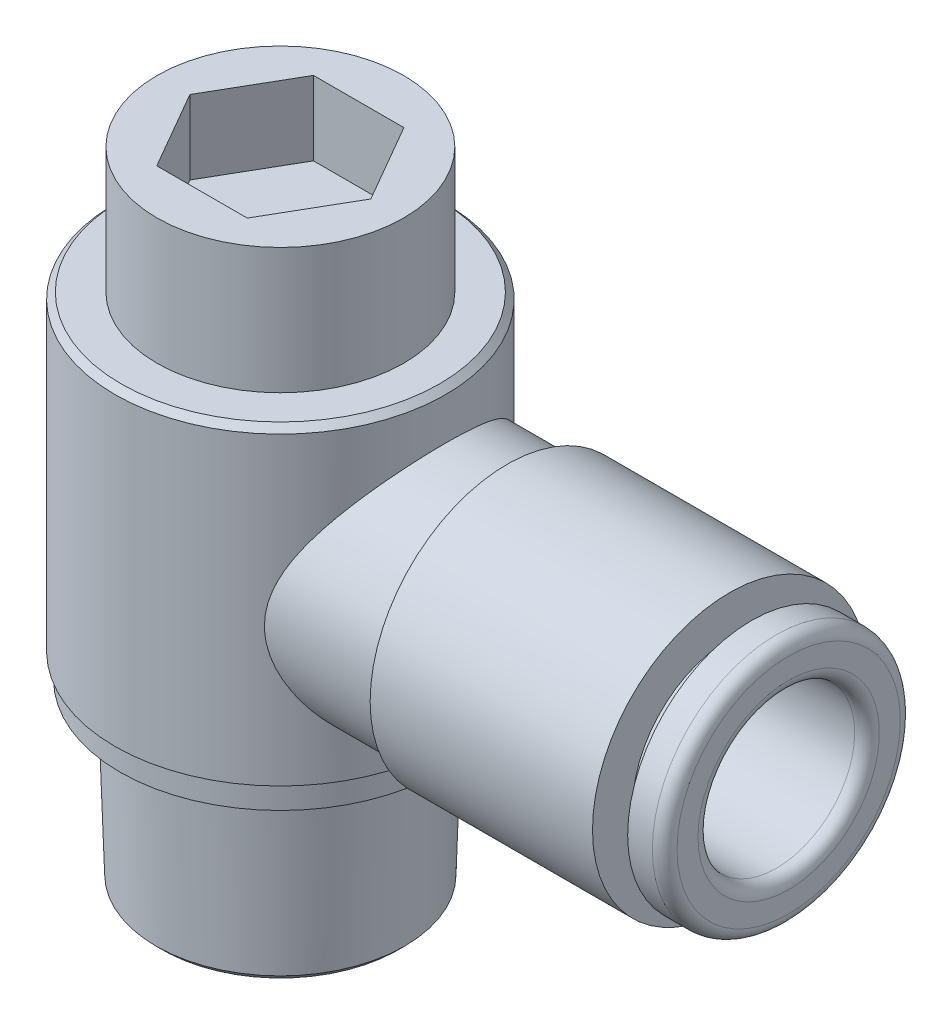
ISO-10303-21;
HEADER;
FILE_DESCRIPTION(('STEP AP214'),'2;1');
FILE_NAME('part.step','',(''),(''),'','','');
FILE_SCHEMA(('AUTOMOTIVE_DESIGN { 1 0 10303 214 1 1 1 1 }'));
ENDSEC;
DATA;
#1=APPLICATION_CONTEXT('core data for automotive mechanical design processes');
#2=APPLICATION_PROTOCOL_DEFINITION('international standard','automotive_design',2000,#1);
#3=PRODUCT_CONTEXT('',#1,'mechanical');
#4=PRODUCT('Part','Part','',(#3));
#5=PRODUCT_RELATED_PRODUCT_CATEGORY('part','',(#4));
#6=PRODUCT_DEFINITION_FORMATION('','',#4);
#7=PRODUCT_DEFINITION_CONTEXT('part definition',#1,'design');
#8=PRODUCT_DEFINITION('design','',#6,#7);
#9=PRODUCT_DEFINITION_SHAPE('','',#8);
#10=(LENGTH_UNIT() NAMED_UNIT(*) SI_UNIT(.MILLI.,.METRE.));
#11=(NAMED_UNIT(*) PLANE_ANGLE_UNIT() SI_UNIT($,.RADIAN.));
#12=(NAMED_UNIT(*) SI_UNIT($,.STERADIAN.) SOLID_ANGLE_UNIT());
#13=UNCERTAINTY_MEASURE_WITH_UNIT(LENGTH_MEASURE(1.E-05),#10,'distance_accuracy_value','');
#14=(GEOMETRIC_REPRESENTATION_CONTEXT(3) GLOBAL_UNCERTAINTY_ASSIGNED_CONTEXT((#13)) GLOBAL_UNIT_ASSIGNED_CONTEXT((#10,
#11,#12)) REPRESENTATION_CONTEXT('',''));
#15=CARTESIAN_POINT('',(0.,0.,0.));
#16=DIRECTION('',(0.,0.,1.));
#17=DIRECTION('',(1.,0.,0.));
#18=AXIS2_PLACEMENT_3D('',#15,#16,#17);
#19=CARTESIAN_POINT('',(0.,25.9504617357995,0.));
#20=DIRECTION('',(0.,-1.,0.));
#21=DIRECTION('',(0.,0.,-1.));
#22=AXIS2_PLACEMENT_3D('',#19,#20,#21);
#23=CYLINDRICAL_SURFACE('',#22,6.7);
#24=CARTESIAN_POINT('',(4.40312389105735,0.,5.05));
#25=CARTESIAN_POINT('',(4.40311942831957,0.117606987015061,5.05000228554377));
#26=CARTESIAN_POINT('',(4.40785952717692,0.235195862721557,5.04588220378257));
#27=CARTESIAN_POINT('',(4.42650886751098,0.469122908838711,5.02953019809049));
#28=CARTESIAN_POINT('',(4.44042241521763,0.585460465772232,5.01729446446795));
#29=CARTESIAN_POINT('',(4.4766420178333,0.815981020724069,4.98500336471046));
#30=CARTESIAN_POINT('',(4.49896785673152,0.930158268112624,4.96492956096863));
#31=CARTESIAN_POINT('',(4.55085121652384,1.15532135639875,4.91741706091188));
#32=CARTESIAN_POINT('',(4.58041326508135,1.26630515039091,4.88997375248413));
#33=CARTESIAN_POINT('',(4.67702968985675,1.5903466816897,4.79824643693401));
#34=CARTESIAN_POINT('',(4.75265483493136,1.79809499274183,4.72403338092795));
#35=CARTESIAN_POINT('',(4.91759208697185,2.19736186323695,4.55208242674168));
#36=CARTESIAN_POINT('',(5.00690207039019,2.38888293359687,4.45434817712701));
#37=CARTESIAN_POINT('',(5.15552000875967,2.68347379216473,4.27996829172208));
#38=CARTESIAN_POINT('',(5.21280439602058,2.79169297708923,4.21015824169164));
#39=CARTESIAN_POINT('',(5.32845753590307,3.00211433049023,4.06279751111986));
#40=CARTESIAN_POINT('',(5.38682647004383,3.10431547958257,3.98524552514834));
#41=CARTESIAN_POINT('',(5.56194115128215,3.4019951706048,3.74097194305351));
#42=CARTESIAN_POINT('',(5.67860127546039,3.58837194310533,3.56273838757504));
#43=CARTESIAN_POINT('',(5.85859222970638,3.86546317468592,3.25348145345614));
#44=CARTESIAN_POINT('',(5.92475500202049,3.96484330894451,3.13169415785285));
#45=CARTESIAN_POINT('',(6.05222642521676,4.15292018332351,2.87762492819221));
#46=CARTESIAN_POINT('',(6.11353396714763,4.24161448516083,2.74534061031245));
#47=CARTESIAN_POINT('',(6.2294332016873,4.40701769419839,2.4710912647562));
#48=CARTESIAN_POINT('',(6.28403763328949,4.48374941319908,2.32914542266936));
#49=CARTESIAN_POINT('',(6.38497994652802,4.62415959134314,2.03617170224928));
#50=CARTESIAN_POINT('',(6.43132226332632,4.68784505656131,1.88514875514576));
#51=CARTESIAN_POINT('',(6.50155338795959,4.78366032363542,1.62242761511721));
#52=CARTESIAN_POINT('',(6.52798400943325,4.81949588634769,1.51274337625082));
#53=CARTESIAN_POINT('',(6.57559930148945,4.88379714156409,1.29013093747716));
#54=CARTESIAN_POINT('',(6.5967851483937,4.91226448671066,1.17720347132818));
#55=CARTESIAN_POINT('',(6.63348053435509,4.96143441656852,0.948842147878617));
#56=CARTESIAN_POINT('',(6.64899392760065,4.98214227375635,0.833410049070694));
#57=CARTESIAN_POINT('',(6.67403953756982,5.01551848834497,0.600737532541452));
#58=CARTESIAN_POINT('',(6.68357153905973,5.02818655644308,0.483497049902969));
#59=CARTESIAN_POINT('',(6.6964594829476,5.04530490137371,0.247782604432587));
#60=CARTESIAN_POINT('',(6.69979998831927,5.04973463797499,0.129306297185757));
#61=CARTESIAN_POINT('',(6.70018262077589,5.05024228893185,-0.107717462110727));
#62=CARTESIAN_POINT('',(6.69722246292009,5.04631717339332,-0.226264924378704));
#63=CARTESIAN_POINT('',(6.68506717613505,5.03017408010857,-0.462446931584983));
#64=CARTESIAN_POINT('',(6.67587320204774,5.01795763836665,-0.580081641532821));
#65=CARTESIAN_POINT('',(6.65145081115923,4.98542005882778,-0.813630900910888));
#66=CARTESIAN_POINT('',(6.63622006947759,4.96509579852751,-0.929544769746802));
#67=CARTESIAN_POINT('',(6.6006912457209,4.91750616015619,-1.15472874531951));
#68=CARTESIAN_POINT('',(6.58059311303766,4.89051398388259,-1.26408840000097));
#69=CARTESIAN_POINT('',(6.53546087013672,4.82961318026325,-1.47983724103222));
#70=CARTESIAN_POINT('',(6.5104250650812,4.79570217791775,-1.58622539307007));
#71=CARTESIAN_POINT('',(6.42856082724111,4.68417221871273,-1.90006472729724));
#72=CARTESIAN_POINT('',(6.36494910175168,4.59672139167553,-2.10235265919328));
#73=CARTESIAN_POINT('',(6.21597295032289,4.38824710372569,-2.51077114243665));
#74=CARTESIAN_POINT('',(6.12900257895077,4.26462035108816,-2.71496405381249));
#75=CARTESIAN_POINT('',(5.94326216260933,3.99307763162445,-3.10056895172942));
#76=CARTESIAN_POINT('',(5.84448230554948,3.84514142816982,-3.28196173414762));
#77=CARTESIAN_POINT('',(5.62052879275241,3.49632469053485,-3.65453605235862));
#78=CARTESIAN_POINT('',(5.49399915283214,3.29075973179338,-3.84055702030748));
#79=CARTESIAN_POINT('',(5.30560799697905,2.96142092969155,-4.09287469077231));
#80=CARTESIAN_POINT('',(5.24300221508765,2.84805748278351,-4.17257392919332));
#81=CARTESIAN_POINT('',(5.11982966890992,2.61438562023011,-4.32281984336322));
#82=CARTESIAN_POINT('',(5.0592624646639,2.49407871851405,-4.39336850346362));
#83=CARTESIAN_POINT('',(4.90590853487717,2.17059781135979,-4.5653272392725));
#84=CARTESIAN_POINT('',(4.8161313853217,1.96183520506052,-4.6591442188435));
#85=CARTESIAN_POINT('',(4.65607358329603,1.52709991459517,-4.81911156540742));
#86=CARTESIAN_POINT('',(4.58574889362723,1.30116760400856,-4.88532459861987));
#87=CARTESIAN_POINT('',(4.48710292142865,0.882598513542438,-4.97589046834176));
#88=CARTESIAN_POINT('',(4.45313554043505,0.692589747040316,-5.00603176540037));
#89=CARTESIAN_POINT('',(4.40973941315301,0.307686663977515,-5.04431386944369));
#90=CARTESIAN_POINT('',(4.40027853767266,0.112799082781473,-5.0524834828872));
#91=CARTESIAN_POINT('',(4.40748599814587,-0.276249928635703,-5.04619384906301));
#92=CARTESIAN_POINT('',(4.42417408734577,-0.470410698729641,-5.03171749476914));
#93=CARTESIAN_POINT('',(4.48088222531931,-0.852475734849247,-4.98127266259116));
#94=CARTESIAN_POINT('',(4.52093764545475,-1.04037005847367,-4.9452716004821));
#95=CARTESIAN_POINT('',(4.63693766473754,-1.47378405618354,-4.83705194720614));
#96=CARTESIAN_POINT('',(4.7206623199853,-1.71509827908915,-4.75638479917287));
#97=CARTESIAN_POINT('',(4.86051687139915,-2.06114431278504,-4.61193306164569));
#98=CARTESIAN_POINT('',(4.90961186768131,-2.17402301509389,-4.55976156501867));
#99=CARTESIAN_POINT('',(5.01114178141282,-2.39449457422574,-4.4479377548332));
#100=CARTESIAN_POINT('',(5.06357666882089,-2.50208747857745,-4.38828550855712));
#101=CARTESIAN_POINT('',(5.18479503134191,-2.74002245800712,-4.24486965990163));
#102=CARTESIAN_POINT('',(5.25419491741833,-2.86873674507521,-4.15892795977774));
#103=CARTESIAN_POINT('',(5.39401333404201,-3.11744224957251,-3.9759144508805));
#104=CARTESIAN_POINT('',(5.46443213830392,-3.23743106886425,-3.8788396009853));
#105=CARTESIAN_POINT('',(5.60425048552661,-3.46821841837122,-3.67392578811485));
#106=CARTESIAN_POINT('',(5.67365110772471,-3.57902736097646,-3.56609933501552));
#107=CARTESIAN_POINT('',(5.80972925732526,-3.7910489346739,-3.33983835724219));
#108=CARTESIAN_POINT('',(5.87640627658064,-3.8922597796465,-3.22140186607884));
#109=CARTESIAN_POINT('',(6.04644185104085,-4.14555123839121,-2.89524977104521));
#110=CARTESIAN_POINT('',(6.14615797077405,-4.28904353226121,-2.6786614021256));
#111=CARTESIAN_POINT('',(6.28122988012699,-4.47976833369188,-2.33482303954838));
#112=CARTESIAN_POINT('',(6.32384523657227,-4.53926892443405,-2.21702059561481));
#113=CARTESIAN_POINT('',(6.40338713423154,-4.6494439239526,-1.97553903031029));
#114=CARTESIAN_POINT('',(6.44031672171642,-4.70012306092306,-1.85186310258579));
#115=CARTESIAN_POINT('',(6.50796901700113,-4.79240577096887,-1.59804967500399));
#116=CARTESIAN_POINT('',(6.53862710946569,-4.83391518588821,-1.4678605892409));
#117=CARTESIAN_POINT('',(6.59246768394957,-4.90649807394438,-1.20315972910773));
#118=CARTESIAN_POINT('',(6.6156542933186,-4.93757730925044,-1.06865038662566));
#119=CARTESIAN_POINT('',(6.65390638342854,-4.9887130629795,-0.796492893098883));
#120=CARTESIAN_POINT('',(6.66897672688346,-5.00877618165064,-0.658846673103729));
#121=CARTESIAN_POINT('',(6.69056065953498,-5.03747880110979,-0.381711265973379));
#122=CARTESIAN_POINT('',(6.697075730508,-5.0461202801318,-0.242222402213161));
#123=CARTESIAN_POINT('',(6.70103250253064,-5.05136976560866,0.0160973440531477));
#124=CARTESIAN_POINT('',(6.69969110649343,-5.04959165729946,0.134881003986158));
#125=CARTESIAN_POINT('',(6.69072502341346,-5.03768964800123,0.371829828877268));
#126=CARTESIAN_POINT('',(6.68309841933952,-5.02756320071173,0.48999479406182));
#127=CARTESIAN_POINT('',(6.66173020574357,-4.99912374116432,0.724726975251465));
#128=CARTESIAN_POINT('',(6.64799105899127,-4.98081402596662,0.841294815267146));
#129=CARTESIAN_POINT('',(6.61470045190201,-4.93629170652048,1.07208280269578));
#130=CARTESIAN_POINT('',(6.59514672618428,-4.91007602202165,1.18630201649778));
#131=CARTESIAN_POINT('',(6.5295767795013,-4.82176655362491,1.5179966363163));
#132=CARTESIAN_POINT('',(6.47599256822721,-4.74914940381472,1.73129472448205));
#133=CARTESIAN_POINT('',(6.3519958517446,-4.57862025999859,2.14203887207685));
#134=CARTESIAN_POINT('',(6.28158052148861,-4.48070401940063,2.33948226290719));
#135=CARTESIAN_POINT('',(6.11780942784385,-4.24826977444291,2.74144830666337));
#136=CARTESIAN_POINT('',(6.02264734543754,-4.11061372136848,2.94341105769372));
#137=CARTESIAN_POINT('',(5.82202528338255,-3.81064058875052,3.3226666968506));
#138=CARTESIAN_POINT('',(5.71655253684358,-3.64829279356433,3.49992832394338));
#139=CARTESIAN_POINT('',(5.5446898071038,-3.37086495944864,3.76302621803477));
#140=CARTESIAN_POINT('',(5.47948587195197,-3.26275039818293,3.85713350670425));
#141=CARTESIAN_POINT('',(5.34917724551684,-3.03883233290902,4.03590488704022));
#142=CARTESIAN_POINT('',(5.28407258335144,-2.92302690001686,4.12056659536197));
#143=CARTESIAN_POINT('',(5.15566948660801,-2.68395218731259,4.28013489403464));
#144=CARTESIAN_POINT('',(5.09237077346732,-2.5606840678572,4.35504299527468));
#145=CARTESIAN_POINT('',(4.9695558004755,-2.30679642913901,4.49468206371764));
#146=CARTESIAN_POINT('',(4.91003800848298,-2.17617992864331,4.5594171691963));
#147=CARTESIAN_POINT('',(4.77375062528088,-1.85226001146856,4.70262065306627));
#148=CARTESIAN_POINT('',(4.69995829986278,-1.65527583106051,4.77578090059542));
#149=CARTESIAN_POINT('',(4.57253393606488,-1.24801789552221,4.89794056928545));
#150=CARTESIAN_POINT('',(4.51884247921434,-1.03778548977778,4.9470113353497));
#151=CARTESIAN_POINT('',(4.45462327831473,-0.688270603940741,5.00473903293676));
#152=CARTESIAN_POINT('',(4.43546080278411,-0.551907261348752,5.02164895851214));
#153=CARTESIAN_POINT('',(4.40971424930551,-0.277020788871616,5.04427764037337));
#154=CARTESIAN_POINT('',(4.40312914652338,-0.138497835884015,5.04999730846887));
#155=CARTESIAN_POINT('',(4.40312389105735,0.,5.05));
#156=B_SPLINE_CURVE_WITH_KNOTS('',3,(#24,#25,#26,#27,#28,#29,#30,#31,#32,#33,#34,#35,#36,#37,
#38,#39,#40,#41,#42,#43,#44,#45,#46,#47,#48,#49,#50,#51,#52,#53,#54,#55,#56,#57,#58,#59,#60,#61,
#62,#63,#64,#65,#66,#67,#68,#69,#70,#71,#72,#73,#74,#75,#76,#77,#78,#79,#80,#81,#82,#83,#84,#85,
#86,#87,#88,#89,#90,#91,#92,#93,#94,#95,#96,#97,#98,#99,#100,#101,#102,#103,#104,#105,#106,#107,
#108,#109,#110,#111,#112,#113,#114,#115,#116,#117,#118,#119,#120,#121,#122,#123,#124,#125,#126,
#127,#128,#129,#130,#131,#132,#133,#134,#135,#136,#137,#138,#139,#140,#141,#142,#143,#144,#145,
#146,#147,#148,#149,#150,#151,#152,#153,#154,#155),.UNSPECIFIED.,.T.,.F.,(4,2,2,2,2,2,2,2,2,2,2,
2,2,2,2,2,2,2,2,2,2,2,2,2,2,2,2,2,2,2,2,2,2,2,2,2,2,2,2,2,2,2,2,2,2,2,2,2,2,2,2,2,2,2,2,2,2,2,2,
2,2,2,2,2,2,4),(0.,0.35262672898936,0.7054191071224,1.05904641253416,1.41289554907151,
2.10965462698784,2.80630569446371,3.22881752681724,3.65140072301648,4.49724306535975,
5.00829900067637,5.51947132827788,6.02965663816903,6.53956724689269,6.89435104631899,
7.24905520099397,7.60351789962037,7.9579933524607,8.31335142296739,8.66883838633034,
9.02425951215359,9.37981765099799,9.72270351598471,10.0657072807565,10.7512171130002,
11.5106441842287,12.2707066803842,13.1811073265463,13.6369356746476,14.0926650080944,
14.8277657979802,15.5611885598813,16.1447703572948,16.7275866631228,17.3108434477816,
17.8949854133622,18.6938464667195,19.0946880697088,19.4955260677604,20.0037520568995,
20.5121172047732,21.0198976048249,21.5277723135731,22.3586691040618,22.7743157862864,
23.1897389962126,23.6092478081498,24.0285244787944,24.4475496671537,24.8665022706156,
25.2224656020363,25.5785375448924,25.934466154572,26.2905336174037,26.9823047017763,
27.6741919792658,28.4582351701166,29.2432617827006,29.7152595838827,30.1873762132745,
30.6594196218932,31.1312705079832,31.7972597702789,32.461264515581,32.8765631301691,
33.2918279037972),.UNSPECIFIED.);
#157=CARTESIAN_POINT('',(4.40312389105735,0.,5.05));
#158=VERTEX_POINT('',#157);
#159=EDGE_CURVE('E128',#158,#158,#156,.T.);
#160=ORIENTED_EDGE('',*,*,#159,.T.);
#161=EDGE_LOOP('',(#160));
#162=FACE_BOUND('',#161,.T.);
#163=CARTESIAN_POINT('',(0.,6.75,0.));
#164=DIRECTION('',(0.,1.,0.));
#165=DIRECTION('',(0.,0.,1.));
#166=AXIS2_PLACEMENT_3D('',#163,#164,#165);
#167=CIRCLE('',#166,6.7);
#168=CARTESIAN_POINT('',(0.,6.75,6.7));
#169=VERTEX_POINT('',#168);
#170=EDGE_CURVE('E167',#169,#169,#167,.F.);
#171=ORIENTED_EDGE('',*,*,#170,.T.);
#172=EDGE_LOOP('',(#171));
#173=FACE_BOUND('',#172,.T.);
#174=CARTESIAN_POINT('',(0.,-5.6,0.));
#175=DIRECTION('',(0.,1.,0.));
#176=DIRECTION('',(0.,0.,1.));
#177=AXIS2_PLACEMENT_3D('',#174,#175,#176);
#178=CIRCLE('',#177,6.7);
#179=CARTESIAN_POINT('',(0.,-5.6,6.7));
#180=VERTEX_POINT('',#179);
#181=EDGE_CURVE('E161',#180,#180,#178,.F.);
#182=ORIENTED_EDGE('',*,*,#181,.F.);
#183=EDGE_LOOP('',(#182));
#184=FACE_BOUND('',#183,.T.);
#185=ADVANCED_FACE('F37',(#162,#173,#184),#23,.T.);
#186=CARTESIAN_POINT('',(0.,7.,0.));
#187=DIRECTION('',(0.,1.,0.));
#188=DIRECTION('',(0.,0.,1.));
#189=AXIS2_PLACEMENT_3D('',#186,#187,#188);
#190=PLANE('',#189);
#191=CARTESIAN_POINT('',(0.,7.,0.));
#192=DIRECTION('',(0.,1.,0.));
#193=DIRECTION('',(0.,0.,1.));
#194=AXIS2_PLACEMENT_3D('',#191,#192,#193);
#195=CIRCLE('',#194,5.);
#196=CARTESIAN_POINT('',(0.,7.,5.));
#197=VERTEX_POINT('',#196);
#198=EDGE_CURVE('E141',#197,#197,#195,.T.);
#199=ORIENTED_EDGE('',*,*,#198,.F.);
#200=EDGE_LOOP('',(#199));
#201=FACE_BOUND('',#200,.T.);
#202=CARTESIAN_POINT('',(0.,7.,0.));
#203=DIRECTION('',(0.,1.,0.));
#204=DIRECTION('',(0.,0.,1.));
#205=AXIS2_PLACEMENT_3D('',#202,#203,#204);
#206=CIRCLE('',#205,6.45);
#207=CARTESIAN_POINT('',(0.,7.,6.45));
#208=VERTEX_POINT('',#207);
#209=EDGE_CURVE('E164',#208,#208,#206,.T.);
#210=ORIENTED_EDGE('',*,*,#209,.T.);
#211=EDGE_LOOP('',(#210));
#212=FACE_BOUND('',#211,.T.);
#213=ADVANCED_FACE('F253',(#201,#212),#190,.T.);
#214=CARTESIAN_POINT('',(0.,-5.6,0.));
#215=DIRECTION('',(0.,1.,0.));
#216=DIRECTION('',(0.,0.,1.));
#217=AXIS2_PLACEMENT_3D('',#214,#215,#216);
#218=PLANE('',#217);
#219=CARTESIAN_POINT('',(0.,-5.6,0.));
#220=DIRECTION('',(0.,1.,0.));
#221=DIRECTION('',(0.,0.,1.));
#222=AXIS2_PLACEMENT_3D('',#219,#220,#221);
#223=CIRCLE('',#222,6.5);
#224=CARTESIAN_POINT('',(0.,-5.6,6.5));
#225=VERTEX_POINT('',#224);
#226=EDGE_CURVE('E155',#225,#225,#223,.T.);
#227=ORIENTED_EDGE('',*,*,#226,.T.);
#228=EDGE_LOOP('',(#227));
#229=FACE_BOUND('',#228,.T.);
#230=ORIENTED_EDGE('',*,*,#181,.T.);
#231=EDGE_LOOP('',(#230));
#232=FACE_BOUND('',#231,.T.);
#233=ADVANCED_FACE('F251',(#229,#232),#218,.F.);
#234=CARTESIAN_POINT('',(0.,7.,0.));
#235=DIRECTION('',(0.,-1.,0.));
#236=DIRECTION('',(0.,0.,-1.));
#237=AXIS2_PLACEMENT_3D('',#234,#235,#236);
#238=CONICAL_SURFACE('',#237,6.45,0.785398163397448);
#239=ORIENTED_EDGE('',*,*,#170,.F.);
#240=EDGE_LOOP('',(#239));
#241=FACE_BOUND('',#240,.T.);
#242=ORIENTED_EDGE('',*,*,#209,.F.);
#243=EDGE_LOOP('',(#242));
#244=FACE_BOUND('',#243,.T.);
#245=ADVANCED_FACE('F249',(#241,#244),#238,.T.);
#246=CARTESIAN_POINT('',(0.,-24.9847763108502,0.));
#247=DIRECTION('',(0.,1.,0.));
#248=DIRECTION('',(0.,0.,1.));
#249=AXIS2_PLACEMENT_3D('',#246,#247,#248);
#250=CYLINDRICAL_SURFACE('',#249,6.5);
#251=CARTESIAN_POINT('',(0.,-6.6,0.));
#252=DIRECTION('',(0.,1.,0.));
#253=DIRECTION('',(0.,0.,1.));
#254=AXIS2_PLACEMENT_3D('',#251,#252,#253);
#255=CIRCLE('',#254,6.5);
#256=CARTESIAN_POINT('',(0.,-6.6,6.5));
#257=VERTEX_POINT('',#256);
#258=EDGE_CURVE('E158',#257,#257,#255,.F.);
#259=ORIENTED_EDGE('',*,*,#258,.F.);
#260=EDGE_LOOP('',(#259));
#261=FACE_BOUND('',#260,.T.);
#262=ORIENTED_EDGE('',*,*,#226,.F.);
#263=EDGE_LOOP('',(#262));
#264=FACE_BOUND('',#263,.T.);
#265=ADVANCED_FACE('F246',(#261,#264),#250,.T.);
#266=CARTESIAN_POINT('',(0.,-6.6,0.));
#267=DIRECTION('',(0.,1.,0.));
#268=DIRECTION('',(0.,0.,1.));
#269=AXIS2_PLACEMENT_3D('',#266,#267,#268);
#270=PLANE('',#269);
#271=CARTESIAN_POINT('',(0.,-6.6,0.));
#272=DIRECTION('',(0.,1.,0.));
#273=DIRECTION('',(0.,0.,1.));
#274=AXIS2_PLACEMENT_3D('',#271,#272,#273);
#275=CIRCLE('',#274,5.24727056951731);
#276=CARTESIAN_POINT('',(0.,-6.6,5.24727056951731));
#277=VERTEX_POINT('',#276);
#278=EDGE_CURVE('E152',#277,#277,#275,.T.);
#279=ORIENTED_EDGE('',*,*,#278,.T.);
#280=EDGE_LOOP('',(#279));
#281=FACE_BOUND('',#280,.T.);
#282=ORIENTED_EDGE('',*,*,#258,.T.);
#283=EDGE_LOOP('',(#282));
#284=FACE_BOUND('',#283,.T.);
#285=ADVANCED_FACE('F242',(#281,#284),#270,.F.);
#286=CARTESIAN_POINT('',(-5.0266248686953,-13.7,0.));
#287=DIRECTION('',(0.,-1.,0.));
#288=DIRECTION('',(0.,0.,-1.));
#289=AXIS2_PLACEMENT_3D('',#286,#287,#288);
#290=PLANE('',#289);
#291=CARTESIAN_POINT('',(0.,-13.7,0.));
#292=DIRECTION('',(0.,1.,0.));
#293=DIRECTION('',(0.,0.,-1.));
#294=AXIS2_PLACEMENT_3D('',#291,#292,#293);
#295=CIRCLE('',#294,1.5875);
#296=CARTESIAN_POINT('',(0.,-13.7,-1.5875));
#297=VERTEX_POINT('',#296);
#298=EDGE_CURVE('E483',#297,#297,#295,.T.);
#299=ORIENTED_EDGE('',*,*,#298,.T.);
#300=EDGE_LOOP('',(#299));
#301=FACE_BOUND('',#300,.T.);
#302=CARTESIAN_POINT('',(0.,-13.7,0.));
#303=DIRECTION('',(0.,-1.,0.));
#304=DIRECTION('',(0.,0.,-1.));
#305=AXIS2_PLACEMENT_3D('',#302,#303,#304);
#306=CIRCLE('',#305,4.77662486869529);
#307=CARTESIAN_POINT('',(0.,-13.7,-4.77662486869529));
#308=VERTEX_POINT('',#307);
#309=EDGE_CURVE('E173',#308,#308,#306,.T.);
#310=ORIENTED_EDGE('',*,*,#309,.T.);
#311=EDGE_LOOP('',(#310));
#312=FACE_BOUND('',#311,.T.);
#313=ADVANCED_FACE('F238',(#301,#312),#290,.T.);
#314=CARTESIAN_POINT('',(0.,-6.6,0.));
#315=DIRECTION('',(0.,1.,0.));
#316=DIRECTION('',(0.,0.,1.));
#317=AXIS2_PLACEMENT_3D('',#314,#315,#316);
#318=CONICAL_SURFACE('',#317,5.24727056951731,0.0310668606855028);
#319=CARTESIAN_POINT('',(0.,-13.4419815984456,0.));
#320=DIRECTION('',(0.,-1.,0.));
#321=DIRECTION('',(0.,0.,-1.));
#322=AXIS2_PLACEMENT_3D('',#319,#320,#321);
#323=CIRCLE('',#322,5.03464327024965);
#324=CARTESIAN_POINT('',(0.,-13.4419815984456,-5.03464327024965));
#325=VERTEX_POINT('',#324);
#326=EDGE_CURVE('E170',#325,#325,#323,.F.);
#327=ORIENTED_EDGE('',*,*,#326,.T.);
#328=EDGE_LOOP('',(#327));
#329=FACE_BOUND('',#328,.T.);
#330=ORIENTED_EDGE('',*,*,#278,.F.);
#331=EDGE_LOOP('',(#330));
#332=FACE_BOUND('',#331,.T.);
#333=ADVANCED_FACE('F235',(#329,#332),#318,.T.);
#334=CARTESIAN_POINT('',(0.,-13.4419815984456,0.));
#335=DIRECTION('',(0.,1.,0.));
#336=DIRECTION('',(0.,0.,1.));
#337=AXIS2_PLACEMENT_3D('',#334,#335,#336);
#338=CONICAL_SURFACE('',#337,5.03464327024965,0.785398163397458);
#339=ORIENTED_EDGE('',*,*,#309,.F.);
#340=EDGE_LOOP('',(#339));
#341=FACE_BOUND('',#340,.T.);
#342=ORIENTED_EDGE('',*,*,#326,.F.);
#343=EDGE_LOOP('',(#342));
#344=FACE_BOUND('',#343,.T.);
#345=ADVANCED_FACE('F230',(#341,#344),#338,.T.);
#346=CARTESIAN_POINT('',(0.,26.242135623731,0.));
#347=DIRECTION('',(0.,-1.,0.));
#348=DIRECTION('',(0.,0.,-1.));
#349=AXIS2_PLACEMENT_3D('',#346,#347,#348);
#350=CYLINDRICAL_SURFACE('',#349,5.);
#351=ORIENTED_EDGE('',*,*,#198,.T.);
#352=EDGE_LOOP('',(#351));
#353=FACE_BOUND('',#352,.T.);
#354=CARTESIAN_POINT('',(0.,12.1,0.));
#355=DIRECTION('',(0.,1.,0.));
#356=DIRECTION('',(0.,0.,1.));
#357=AXIS2_PLACEMENT_3D('',#354,#355,#356);
#358=CIRCLE('',#357,5.);
#359=CARTESIAN_POINT('',(0.,12.1,5.));
#360=VERTEX_POINT('',#359);
#361=EDGE_CURVE('E149',#360,#360,#358,.T.);
#362=ORIENTED_EDGE('',*,*,#361,.F.);
#363=EDGE_LOOP('',(#362));
#364=FACE_BOUND('',#363,.T.);
#365=ADVANCED_FACE('F227',(#353,#364),#350,.T.);
#366=CARTESIAN_POINT('',(0.,12.1,0.));
#367=DIRECTION('',(0.,1.,0.));
#368=DIRECTION('',(0.,0.,1.));
#369=AXIS2_PLACEMENT_3D('',#366,#367,#368);
#370=PLANE('',#369);
#371=DIRECTION('',(1.,0.,0.));
#372=VECTOR('',#371,1.);
#373=CARTESIAN_POINT('',(-1.83308710467706,12.1,3.175));
#374=LINE('',#373,#372);
#375=CARTESIAN_POINT('',(-1.83308710467706,12.1,3.175));
#376=VERTEX_POINT('',#375);
#377=CARTESIAN_POINT('',(1.83308710467706,12.1,3.175));
#378=VERTEX_POINT('',#377);
#379=EDGE_CURVE('E53',#376,#378,#374,.T.);
#380=ORIENTED_EDGE('',*,*,#379,.F.);
#381=DIRECTION('',(0.5,0.,0.866025403784439));
#382=VECTOR('',#381,1.);
#383=CARTESIAN_POINT('',(-3.66617420935412,12.1,0.));
#384=LINE('',#383,#382);
#385=CARTESIAN_POINT('',(-3.66617420935412,12.1,0.));
#386=VERTEX_POINT('',#385);
#387=EDGE_CURVE('E137',#386,#376,#384,.T.);
#388=ORIENTED_EDGE('',*,*,#387,.F.);
#389=DIRECTION('',(-0.5,0.,0.866025403784438));
#390=VECTOR('',#389,1.);
#391=CARTESIAN_POINT('',(-1.83308710467706,12.1,-3.175));
#392=LINE('',#391,#390);
#393=CARTESIAN_POINT('',(-1.83308710467706,12.1,-3.175));
#394=VERTEX_POINT('',#393);
#395=EDGE_CURVE('E135',#394,#386,#392,.T.);
#396=ORIENTED_EDGE('',*,*,#395,.F.);
#397=DIRECTION('',(-1.,0.,0.));
#398=VECTOR('',#397,1.);
#399=CARTESIAN_POINT('',(1.83308710467706,12.1,-3.175));
#400=LINE('',#399,#398);
#401=CARTESIAN_POINT('',(1.83308710467706,12.1,-3.175));
#402=VERTEX_POINT('',#401);
#403=EDGE_CURVE('E101',#402,#394,#400,.T.);
#404=ORIENTED_EDGE('',*,*,#403,.F.);
#405=DIRECTION('',(-0.5,0.,-0.866025403784439));
#406=VECTOR('',#405,1.);
#407=CARTESIAN_POINT('',(3.66617420935412,12.1,0.));
#408=LINE('',#407,#406);
#409=CARTESIAN_POINT('',(3.66617420935412,12.1,0.));
#410=VERTEX_POINT('',#409);
#411=EDGE_CURVE('E131',#410,#402,#408,.T.);
#412=ORIENTED_EDGE('',*,*,#411,.F.);
#413=DIRECTION('',(0.5,0.,-0.866025403784439));
#414=VECTOR('',#413,1.);
#415=CARTESIAN_POINT('',(1.83308710467706,12.1,3.175));
#416=LINE('',#415,#414);
#417=EDGE_CURVE('E127',#378,#410,#416,.T.);
#418=ORIENTED_EDGE('',*,*,#417,.F.);
#419=EDGE_LOOP('',(#380,#388,#396,#404,#412,#418));
#420=FACE_BOUND('',#419,.T.);
#421=ORIENTED_EDGE('',*,*,#361,.T.);
#422=EDGE_LOOP('',(#421));
#423=FACE_BOUND('',#422,.T.);
#424=ADVANCED_FACE('F226',(#420,#423),#370,.T.);
#425=CARTESIAN_POINT('',(-1.83308710467706,9.1,3.175));
#426=DIRECTION('',(0.,0.,1.));
#427=DIRECTION('',(1.,0.,0.));
#428=AXIS2_PLACEMENT_3D('',#425,#426,#427);
#429=PLANE('',#428);
#430=ORIENTED_EDGE('',*,*,#379,.T.);
#431=DIRECTION('',(0.,1.,0.));
#432=VECTOR('',#431,1.);
#433=CARTESIAN_POINT('',(1.83308710467706,9.1,3.175));
#434=LINE('',#433,#432);
#435=CARTESIAN_POINT('',(1.83308710467706,9.1,3.175));
#436=VERTEX_POINT('',#435);
#437=EDGE_CURVE('E83',#436,#378,#434,.T.);
#438=ORIENTED_EDGE('',*,*,#437,.F.);
#439=DIRECTION('',(1.,0.,0.));
#440=VECTOR('',#439,1.);
#441=CARTESIAN_POINT('',(-1.83308710467706,9.1,3.175));
#442=LINE('',#441,#440);
#443=CARTESIAN_POINT('',(-1.83308710467706,9.1,3.175));
#444=VERTEX_POINT('',#443);
#445=EDGE_CURVE('E139',#444,#436,#442,.T.);
#446=ORIENTED_EDGE('',*,*,#445,.F.);
#447=DIRECTION('',(0.,1.,0.));
#448=VECTOR('',#447,1.);
#449=CARTESIAN_POINT('',(-1.83308710467706,9.1,3.175));
#450=LINE('',#449,#448);
#451=EDGE_CURVE('E61',#444,#376,#450,.T.);
#452=ORIENTED_EDGE('',*,*,#451,.T.);
#453=EDGE_LOOP('',(#430,#438,#446,#452));
#454=FACE_BOUND('',#453,.T.);
#455=ADVANCED_FACE('F212',(#454),#429,.F.);
#456=CARTESIAN_POINT('',(-3.66617420935412,9.1,0.));
#457=DIRECTION('',(-0.866025403784439,0.,0.5));
#458=DIRECTION('',(0.5,0.,0.866025403784439));
#459=AXIS2_PLACEMENT_3D('',#456,#457,#458);
#460=PLANE('',#459);
#461=ORIENTED_EDGE('',*,*,#387,.T.);
#462=ORIENTED_EDGE('',*,*,#451,.F.);
#463=DIRECTION('',(0.5,0.,0.866025403784439));
#464=VECTOR('',#463,1.);
#465=CARTESIAN_POINT('',(-3.66617420935412,9.1,0.));
#466=LINE('',#465,#464);
#467=CARTESIAN_POINT('',(-3.66617420935412,9.1,0.));
#468=VERTEX_POINT('',#467);
#469=EDGE_CURVE('E113',#468,#444,#466,.T.);
#470=ORIENTED_EDGE('',*,*,#469,.F.);
#471=DIRECTION('',(0.,1.,0.));
#472=VECTOR('',#471,1.);
#473=CARTESIAN_POINT('',(-3.66617420935412,9.1,0.));
#474=LINE('',#473,#472);
#475=EDGE_CURVE('E105',#468,#386,#474,.T.);
#476=ORIENTED_EDGE('',*,*,#475,.T.);
#477=EDGE_LOOP('',(#461,#462,#470,#476));
#478=FACE_BOUND('',#477,.T.);
#479=ADVANCED_FACE('F209',(#478),#460,.F.);
#480=CARTESIAN_POINT('',(-1.83308710467706,9.1,-3.175));
#481=DIRECTION('',(-0.866025403784439,0.,-0.5));
#482=DIRECTION('',(-0.5,0.,0.866025403784439));
#483=AXIS2_PLACEMENT_3D('',#480,#481,#482);
#484=PLANE('',#483);
#485=ORIENTED_EDGE('',*,*,#395,.T.);
#486=ORIENTED_EDGE('',*,*,#475,.F.);
#487=DIRECTION('',(-0.5,0.,0.866025403784438));
#488=VECTOR('',#487,1.);
#489=CARTESIAN_POINT('',(-1.83308710467706,9.1,-3.175));
#490=LINE('',#489,#488);
#491=CARTESIAN_POINT('',(-1.83308710467706,9.1,-3.175));
#492=VERTEX_POINT('',#491);
#493=EDGE_CURVE('E109',#492,#468,#490,.T.);
#494=ORIENTED_EDGE('',*,*,#493,.F.);
#495=DIRECTION('',(0.,1.,0.));
#496=VECTOR('',#495,1.);
#497=CARTESIAN_POINT('',(-1.83308710467706,9.1,-3.175));
#498=LINE('',#497,#496);
#499=EDGE_CURVE('E94',#492,#394,#498,.T.);
#500=ORIENTED_EDGE('',*,*,#499,.T.);
#501=EDGE_LOOP('',(#485,#486,#494,#500));
#502=FACE_BOUND('',#501,.T.);
#503=ADVANCED_FACE('F110',(#502),#484,.F.);
#504=CARTESIAN_POINT('',(1.83308710467706,9.1,-3.175));
#505=DIRECTION('',(0.,0.,-1.));
#506=DIRECTION('',(-1.,0.,0.));
#507=AXIS2_PLACEMENT_3D('',#504,#505,#506);
#508=PLANE('',#507);
#509=ORIENTED_EDGE('',*,*,#403,.T.);
#510=ORIENTED_EDGE('',*,*,#499,.F.);
#511=DIRECTION('',(-1.,0.,0.));
#512=VECTOR('',#511,1.);
#513=CARTESIAN_POINT('',(1.83308710467706,9.1,-3.175));
#514=LINE('',#513,#512);
#515=CARTESIAN_POINT('',(1.83308710467706,9.1,-3.175));
#516=VERTEX_POINT('',#515);
#517=EDGE_CURVE('E98',#516,#492,#514,.T.);
#518=ORIENTED_EDGE('',*,*,#517,.F.);
#519=DIRECTION('',(0.,1.,0.));
#520=VECTOR('',#519,1.);
#521=CARTESIAN_POINT('',(1.83308710467706,9.1,-3.175));
#522=LINE('',#521,#520);
#523=EDGE_CURVE('E106',#516,#402,#522,.T.);
#524=ORIENTED_EDGE('',*,*,#523,.T.);
#525=EDGE_LOOP('',(#509,#510,#518,#524));
#526=FACE_BOUND('',#525,.T.);
#527=ADVANCED_FACE('F96',(#526),#508,.F.);
#528=CARTESIAN_POINT('',(3.66617420935412,9.1,0.));
#529=DIRECTION('',(0.866025403784439,0.,-0.5));
#530=DIRECTION('',(-0.5,0.,-0.866025403784439));
#531=AXIS2_PLACEMENT_3D('',#528,#529,#530);
#532=PLANE('',#531);
#533=ORIENTED_EDGE('',*,*,#411,.T.);
#534=ORIENTED_EDGE('',*,*,#523,.F.);
#535=DIRECTION('',(-0.5,0.,-0.866025403784439));
#536=VECTOR('',#535,1.);
#537=CARTESIAN_POINT('',(3.66617420935412,9.1,0.));
#538=LINE('',#537,#536);
#539=CARTESIAN_POINT('',(3.66617420935412,9.1,0.));
#540=VERTEX_POINT('',#539);
#541=EDGE_CURVE('E119',#540,#516,#538,.T.);
#542=ORIENTED_EDGE('',*,*,#541,.F.);
#543=DIRECTION('',(0.,1.,0.));
#544=VECTOR('',#543,1.);
#545=CARTESIAN_POINT('',(3.66617420935412,9.1,0.));
#546=LINE('',#545,#544);
#547=EDGE_CURVE('E144',#540,#410,#546,.T.);
#548=ORIENTED_EDGE('',*,*,#547,.T.);
#549=EDGE_LOOP('',(#533,#534,#542,#548));
#550=FACE_BOUND('',#549,.T.);
#551=ADVANCED_FACE('F217',(#550),#532,.F.);
#552=CARTESIAN_POINT('',(1.83308710467706,9.1,3.175));
#553=DIRECTION('',(0.866025403784439,0.,0.5));
#554=DIRECTION('',(0.5,0.,-0.866025403784439));
#555=AXIS2_PLACEMENT_3D('',#552,#553,#554);
#556=PLANE('',#555);
#557=ORIENTED_EDGE('',*,*,#417,.T.);
#558=ORIENTED_EDGE('',*,*,#547,.F.);
#559=DIRECTION('',(0.5,0.,-0.866025403784439));
#560=VECTOR('',#559,1.);
#561=CARTESIAN_POINT('',(1.83308710467706,9.1,3.175));
#562=LINE('',#561,#560);
#563=EDGE_CURVE('E121',#436,#540,#562,.T.);
#564=ORIENTED_EDGE('',*,*,#563,.F.);
#565=ORIENTED_EDGE('',*,*,#437,.T.);
#566=EDGE_LOOP('',(#557,#558,#564,#565));
#567=FACE_BOUND('',#566,.T.);
#568=ADVANCED_FACE('F208',(#567),#556,.F.);
#569=CARTESIAN_POINT('',(5.49926131403118,9.1,3.175));
#570=DIRECTION('',(0.,1.,0.));
#571=DIRECTION('',(0.,0.,1.));
#572=AXIS2_PLACEMENT_3D('',#569,#570,#571);
#573=PLANE('',#572);
#574=ORIENTED_EDGE('',*,*,#445,.T.);
#575=ORIENTED_EDGE('',*,*,#563,.T.);
#576=ORIENTED_EDGE('',*,*,#541,.T.);
#577=ORIENTED_EDGE('',*,*,#517,.T.);
#578=ORIENTED_EDGE('',*,*,#493,.T.);
#579=ORIENTED_EDGE('',*,*,#469,.T.);
#580=EDGE_LOOP('',(#574,#575,#576,#577,#578,#579));
#581=FACE_BOUND('',#580,.T.);
#582=ADVANCED_FACE('F116',(#581),#573,.T.);
#583=CARTESIAN_POINT('',(-16.3355334196476,0.,0.));
#584=DIRECTION('',(-1.,0.,0.));
#585=DIRECTION('',(0.,0.,1.));
#586=AXIS2_PLACEMENT_3D('',#583,#584,#585);
#587=CYLINDRICAL_SURFACE('',#586,5.05);
#588=CARTESIAN_POINT('',(8.9,0.,0.));
#589=DIRECTION('',(-1.,0.,0.));
#590=DIRECTION('',(0.,0.,1.));
#591=AXIS2_PLACEMENT_3D('',#588,#589,#590);
#592=CIRCLE('',#591,5.05);
#593=CARTESIAN_POINT('',(8.9,0.,5.05));
#594=VERTEX_POINT('',#593);
#595=EDGE_CURVE('E506',#594,#594,#592,.T.);
#596=ORIENTED_EDGE('',*,*,#595,.T.);
#597=EDGE_LOOP('',(#596));
#598=FACE_BOUND('',#597,.T.);
#599=ORIENTED_EDGE('',*,*,#159,.F.);
#600=EDGE_LOOP('',(#599));
#601=FACE_BOUND('',#600,.T.);
#602=ADVANCED_FACE('F186',(#598,#601),#587,.T.);
#603=CARTESIAN_POINT('',(18.2,0.,5.55));
#604=DIRECTION('',(1.,0.,0.));
#605=DIRECTION('',(0.,0.,-1.));
#606=AXIS2_PLACEMENT_3D('',#603,#604,#605);
#607=PLANE('',#606);
#608=CARTESIAN_POINT('',(18.2,0.,0.));
#609=DIRECTION('',(-1.,0.,0.));
#610=DIRECTION('',(0.,0.,1.));
#611=AXIS2_PLACEMENT_3D('',#608,#609,#610);
#612=CIRCLE('',#611,3.925);
#613=CARTESIAN_POINT('',(18.2,0.,3.925));
#614=VERTEX_POINT('',#613);
#615=EDGE_CURVE('E491',#614,#614,#612,.T.);
#616=ORIENTED_EDGE('',*,*,#615,.T.);
#617=EDGE_LOOP('',(#616));
#618=FACE_BOUND('',#617,.T.);
#619=CARTESIAN_POINT('',(18.2,0.,0.));
#620=DIRECTION('',(-1.,0.,0.));
#621=DIRECTION('',(0.,0.,1.));
#622=AXIS2_PLACEMENT_3D('',#619,#620,#621);
#623=CIRCLE('',#622,5.55);
#624=CARTESIAN_POINT('',(18.2,0.,5.55));
#625=VERTEX_POINT('',#624);
#626=EDGE_CURVE('E182',#625,#625,#623,.T.);
#627=ORIENTED_EDGE('',*,*,#626,.F.);
#628=EDGE_LOOP('',(#627));
#629=FACE_BOUND('',#628,.T.);
#630=ADVANCED_FACE('F191',(#618,#629),#607,.T.);
#631=CARTESIAN_POINT('',(-16.3355334196476,0.,0.));
#632=DIRECTION('',(-1.,0.,0.));
#633=DIRECTION('',(0.,0.,1.));
#634=AXIS2_PLACEMENT_3D('',#631,#632,#633);
#635=CYLINDRICAL_SURFACE('',#634,5.55);
#636=ORIENTED_EDGE('',*,*,#626,.T.);
#637=EDGE_LOOP('',(#636));
#638=FACE_BOUND('',#637,.T.);
#639=CARTESIAN_POINT('',(9.18867513459482,0.,0.));
#640=DIRECTION('',(-1.,0.,0.));
#641=DIRECTION('',(0.,0.,1.));
#642=AXIS2_PLACEMENT_3D('',#639,#640,#641);
#643=CIRCLE('',#642,5.55);
#644=CARTESIAN_POINT('',(9.18867513459482,0.,5.55));
#645=VERTEX_POINT('',#644);
#646=EDGE_CURVE('E509',#645,#645,#643,.T.);
#647=ORIENTED_EDGE('',*,*,#646,.F.);
#648=EDGE_LOOP('',(#647));
#649=FACE_BOUND('',#648,.T.);
#650=ADVANCED_FACE('F198',(#638,#649),#635,.T.);
#651=CARTESIAN_POINT('',(8.9,0.,0.));
#652=DIRECTION('',(1.,0.,0.));
#653=DIRECTION('',(0.,0.,-1.));
#654=AXIS2_PLACEMENT_3D('',#651,#652,#653);
#655=CONICAL_SURFACE('',#654,5.05,1.0471975511966);
#656=ORIENTED_EDGE('',*,*,#646,.T.);
#657=EDGE_LOOP('',(#656));
#658=FACE_BOUND('',#657,.T.);
#659=ORIENTED_EDGE('',*,*,#595,.F.);
#660=EDGE_LOOP('',(#659));
#661=FACE_BOUND('',#660,.T.);
#662=ADVANCED_FACE('F195',(#658,#661),#655,.T.);
#663=CARTESIAN_POINT('',(20.6,0.,-4.525));
#664=DIRECTION('',(-1.,0.,0.));
#665=DIRECTION('',(0.,0.,1.));
#666=AXIS2_PLACEMENT_3D('',#663,#664,#665);
#667=PLANE('',#666);
#668=CARTESIAN_POINT('',(20.6,0.,0.));
#669=DIRECTION('',(-1.,0.,0.));
#670=DIRECTION('',(0.,0.,1.));
#671=AXIS2_PLACEMENT_3D('',#668,#669,#670);
#672=CIRCLE('',#671,3.675);
#673=CARTESIAN_POINT('',(20.6,0.,3.675));
#674=VERTEX_POINT('',#673);
#675=EDGE_CURVE('E11',#674,#674,#672,.T.);
#676=ORIENTED_EDGE('',*,*,#675,.T.);
#677=EDGE_LOOP('',(#676));
#678=FACE_BOUND('',#677,.T.);
#679=CARTESIAN_POINT('',(20.6,0.,0.));
#680=DIRECTION('',(-1.,0.,0.));
#681=DIRECTION('',(0.,0.,1.));
#682=AXIS2_PLACEMENT_3D('',#679,#680,#681);
#683=CIRCLE('',#682,4.525);
#684=CARTESIAN_POINT('',(20.6,0.,4.525));
#685=VERTEX_POINT('',#684);
#686=EDGE_CURVE('E503',#685,#685,#683,.T.);
#687=ORIENTED_EDGE('',*,*,#686,.F.);
#688=EDGE_LOOP('',(#687));
#689=FACE_BOUND('',#688,.T.);
#690=ADVANCED_FACE('F193',(#678,#689),#667,.F.);
#691=CARTESIAN_POINT('',(20.1,0.,0.));
#692=DIRECTION('',(-1.,0.,0.));
#693=DIRECTION('',(0.,0.,1.));
#694=AXIS2_PLACEMENT_3D('',#691,#692,#693);
#695=TOROIDAL_SURFACE('',#694,4.525,0.499999999999999);
#696=CARTESIAN_POINT('',(20.1,0.,0.));
#697=DIRECTION('',(-1.,0.,0.));
#698=DIRECTION('',(0.,0.,1.));
#699=AXIS2_PLACEMENT_3D('',#696,#697,#698);
#700=CIRCLE('',#699,5.025);
#701=CARTESIAN_POINT('',(20.1,0.,5.025));
#702=VERTEX_POINT('',#701);
#703=EDGE_CURVE('E500',#702,#702,#700,.T.);
#704=ORIENTED_EDGE('',*,*,#703,.F.);
#705=EDGE_LOOP('',(#704));
#706=FACE_BOUND('',#705,.T.);
#707=ORIENTED_EDGE('',*,*,#686,.T.);
#708=EDGE_LOOP('',(#707));
#709=FACE_BOUND('',#708,.T.);
#710=ADVANCED_FACE('F365',(#706,#709),#695,.T.);
#711=CARTESIAN_POINT('',(0.,0.,0.));
#712=DIRECTION('',(-1.,0.,0.));
#713=DIRECTION('',(0.,0.,1.));
#714=AXIS2_PLACEMENT_3D('',#711,#712,#713);
#715=CYLINDRICAL_SURFACE('',#714,5.025);
#716=CARTESIAN_POINT('',(19.1,0.,0.));
#717=DIRECTION('',(-1.,0.,0.));
#718=DIRECTION('',(0.,0.,1.));
#719=AXIS2_PLACEMENT_3D('',#716,#717,#718);
#720=CIRCLE('',#719,5.025);
#721=CARTESIAN_POINT('',(19.1,0.,5.025));
#722=VERTEX_POINT('',#721);
#723=EDGE_CURVE('E497',#722,#722,#720,.T.);
#724=ORIENTED_EDGE('',*,*,#723,.F.);
#725=EDGE_LOOP('',(#724));
#726=FACE_BOUND('',#725,.T.);
#727=ORIENTED_EDGE('',*,*,#703,.T.);
#728=EDGE_LOOP('',(#727));
#729=FACE_BOUND('',#728,.T.);
#730=ADVANCED_FACE('F373',(#726,#729),#715,.T.);
#731=CARTESIAN_POINT('',(19.1,0.,-3.925));
#732=DIRECTION('',(1.,0.,0.));
#733=DIRECTION('',(0.,0.,-1.));
#734=AXIS2_PLACEMENT_3D('',#731,#732,#733);
#735=PLANE('',#734);
#736=CARTESIAN_POINT('',(19.1,0.,0.));
#737=DIRECTION('',(-1.,0.,0.));
#738=DIRECTION('',(0.,0.,1.));
#739=AXIS2_PLACEMENT_3D('',#736,#737,#738);
#740=CIRCLE('',#739,3.925);
#741=CARTESIAN_POINT('',(19.1,0.,3.925));
#742=VERTEX_POINT('',#741);
#743=EDGE_CURVE('E494',#742,#742,#740,.T.);
#744=ORIENTED_EDGE('',*,*,#743,.F.);
#745=EDGE_LOOP('',(#744));
#746=FACE_BOUND('',#745,.T.);
#747=ORIENTED_EDGE('',*,*,#723,.T.);
#748=EDGE_LOOP('',(#747));
#749=FACE_BOUND('',#748,.T.);
#750=ADVANCED_FACE('F380',(#746,#749),#735,.F.);
#751=CARTESIAN_POINT('',(0.,0.,0.));
#752=DIRECTION('',(-1.,0.,0.));
#753=DIRECTION('',(0.,0.,1.));
#754=AXIS2_PLACEMENT_3D('',#751,#752,#753);
#755=CYLINDRICAL_SURFACE('',#754,3.925);
#756=ORIENTED_EDGE('',*,*,#615,.F.);
#757=EDGE_LOOP('',(#756));
#758=FACE_BOUND('',#757,.T.);
#759=ORIENTED_EDGE('',*,*,#743,.T.);
#760=EDGE_LOOP('',(#759));
#761=FACE_BOUND('',#760,.T.);
#762=ADVANCED_FACE('F388',(#758,#761),#755,.T.);
#763=CARTESIAN_POINT('',(-1.68025612106916,0.,0.));
#764=DIRECTION('',(1.,0.,0.));
#765=DIRECTION('',(0.,0.,-1.));
#766=AXIS2_PLACEMENT_3D('',#763,#764,#765);
#767=CYLINDRICAL_SURFACE('',#766,3.175);
#768=CARTESIAN_POINT('',(20.1,0.,0.));
#769=DIRECTION('',(-1.,0.,0.));
#770=DIRECTION('',(0.,0.,1.));
#771=AXIS2_PLACEMENT_3D('',#768,#769,#770);
#772=CIRCLE('',#771,3.175);
#773=CARTESIAN_POINT('',(20.1,0.,-3.175));
#774=VERTEX_POINT('',#773);
#775=EDGE_CURVE('E46',#774,#774,#772,.F.);
#776=CARTESIAN_POINT('',(7.3,0.,0.));
#777=DIRECTION('',(1.,0.,0.));
#778=DIRECTION('',(0.,0.,-1.));
#779=AXIS2_PLACEMENT_3D('',#776,#777,#778);
#780=CIRCLE('',#779,3.175);
#781=CARTESIAN_POINT('',(7.3,0.,-3.175));
#782=VERTEX_POINT('',#781);
#783=EDGE_CURVE('E488',#782,#782,#780,.F.);
#784=CARTESIAN_POINT('',(20.1,0.,-3.175));
#785=CARTESIAN_POINT('',(19.9666666666667,0.,-3.175));
#786=CARTESIAN_POINT('',(19.8333333333333,0.,-3.175));
#787=CARTESIAN_POINT('',(19.5666666666667,0.,-3.175));
#788=CARTESIAN_POINT('',(19.4333333333333,0.,-3.175));
#789=CARTESIAN_POINT('',(19.1666666666667,0.,-3.175));
#790=CARTESIAN_POINT('',(19.0333333333333,0.,-3.175));
#791=CARTESIAN_POINT('',(18.7666666666667,0.,-3.175));
#792=CARTESIAN_POINT('',(18.6333333333333,0.,-3.175));
#793=CARTESIAN_POINT('',(18.3666666666667,0.,-3.175));
#794=CARTESIAN_POINT('',(18.2333333333333,0.,-3.175));
#795=CARTESIAN_POINT('',(17.9666666666667,0.,-3.175));
#796=CARTESIAN_POINT('',(17.8333333333333,0.,-3.175));
#797=CARTESIAN_POINT('',(17.5666666666667,0.,-3.175));
#798=CARTESIAN_POINT('',(17.4333333333333,0.,-3.175));
#799=CARTESIAN_POINT('',(17.1666666666667,0.,-3.175));
#800=CARTESIAN_POINT('',(17.0333333333333,0.,-3.175));
#801=CARTESIAN_POINT('',(16.7666666666667,0.,-3.175));
#802=CARTESIAN_POINT('',(16.6333333333333,0.,-3.175));
#803=CARTESIAN_POINT('',(16.3666666666667,0.,-3.175));
#804=CARTESIAN_POINT('',(16.2333333333333,0.,-3.175));
#805=CARTESIAN_POINT('',(15.9666666666667,0.,-3.175));
#806=CARTESIAN_POINT('',(15.8333333333333,0.,-3.175));
#807=CARTESIAN_POINT('',(15.5666666666667,0.,-3.175));
#808=CARTESIAN_POINT('',(15.4333333333333,0.,-3.175));
#809=CARTESIAN_POINT('',(15.1666666666667,0.,-3.175));
#810=CARTESIAN_POINT('',(15.0333333333333,0.,-3.175));
#811=CARTESIAN_POINT('',(14.7666666666667,0.,-3.175));
#812=CARTESIAN_POINT('',(14.6333333333333,0.,-3.175));
#813=CARTESIAN_POINT('',(14.3666666666667,0.,-3.175));
#814=CARTESIAN_POINT('',(14.2333333333333,0.,-3.175));
#815=CARTESIAN_POINT('',(13.9666666666667,0.,-3.175));
#816=CARTESIAN_POINT('',(13.8333333333333,0.,-3.175));
#817=CARTESIAN_POINT('',(13.5666666666667,0.,-3.175));
#818=CARTESIAN_POINT('',(13.4333333333333,0.,-3.175));
#819=CARTESIAN_POINT('',(13.1666666666667,0.,-3.175));
#820=CARTESIAN_POINT('',(13.0333333333333,0.,-3.175));
#821=CARTESIAN_POINT('',(12.7666666666667,0.,-3.175));
#822=CARTESIAN_POINT('',(12.6333333333333,0.,-3.175));
#823=CARTESIAN_POINT('',(12.3666666666667,0.,-3.175));
#824=CARTESIAN_POINT('',(12.2333333333333,0.,-3.175));
#825=CARTESIAN_POINT('',(11.9666666666667,0.,-3.175));
#826=CARTESIAN_POINT('',(11.8333333333333,0.,-3.175));
#827=CARTESIAN_POINT('',(11.5666666666667,0.,-3.175));
#828=CARTESIAN_POINT('',(11.4333333333333,0.,-3.175));
#829=CARTESIAN_POINT('',(11.1666666666667,0.,-3.175));
#830=CARTESIAN_POINT('',(11.0333333333333,0.,-3.175));
#831=CARTESIAN_POINT('',(10.7666666666667,0.,-3.175));
#832=CARTESIAN_POINT('',(10.6333333333333,0.,-3.175));
#833=CARTESIAN_POINT('',(10.3666666666667,0.,-3.175));
#834=CARTESIAN_POINT('',(10.2333333333333,0.,-3.175));
#835=CARTESIAN_POINT('',(9.96666666666667,0.,-3.175));
#836=CARTESIAN_POINT('',(9.83333333333333,0.,-3.175));
#837=CARTESIAN_POINT('',(9.56666666666667,0.,-3.175));
#838=CARTESIAN_POINT('',(9.43333333333333,0.,-3.175));
#839=CARTESIAN_POINT('',(9.16666666666667,0.,-3.175));
#840=CARTESIAN_POINT('',(9.03333333333333,0.,-3.175));
#841=CARTESIAN_POINT('',(8.76666666666667,0.,-3.175));
#842=CARTESIAN_POINT('',(8.63333333333333,0.,-3.175));
#843=CARTESIAN_POINT('',(8.36666666666667,0.,-3.175));
#844=CARTESIAN_POINT('',(8.23333333333333,0.,-3.175));
#845=CARTESIAN_POINT('',(7.96666666666667,0.,-3.175));
#846=CARTESIAN_POINT('',(7.83333333333333,0.,-3.175));
#847=CARTESIAN_POINT('',(7.56666666666667,0.,-3.175));
#848=CARTESIAN_POINT('',(7.43333333333333,0.,-3.175));
#849=CARTESIAN_POINT('',(7.3,0.,-3.175));
#850=B_SPLINE_CURVE_WITH_KNOTS('',3,(#784,#785,#786,#787,#788,#789,#790,#791,#792,#793,#794,
#795,#796,#797,#798,#799,#800,#801,#802,#803,#804,#805,#806,#807,#808,#809,#810,#811,#812,#813,
#814,#815,#816,#817,#818,#819,#820,#821,#822,#823,#824,#825,#826,#827,#828,#829,#830,#831,#832,
#833,#834,#835,#836,#837,#838,#839,#840,#841,#842,#843,#844,#845,#846,#847,#848,#849),
.UNSPECIFIED.,.F.,.F.,(4,2,2,2,2,2,2,2,2,2,2,2,2,2,2,2,2,2,2,2,2,2,2,2,2,2,2,2,2,2,2,2,4),(0.,
0.400000000000001,0.799999999999999,1.2,1.6,2.,2.4,2.8,3.2,3.6,4.,4.4,4.8,5.2,5.6,6.,6.4,6.8,
7.2,7.6,8.,8.4,8.8,9.2,9.6,10.,10.4,10.8,11.2,11.6,12.,12.4,12.8),.UNSPECIFIED.);
#851=EDGE_CURVE('BSEAM395',#774,#782,#850,.T.);
#852=ORIENTED_EDGE('',*,*,#775,.T.);
#853=ORIENTED_EDGE('',*,*,#783,.T.);
#854=ORIENTED_EDGE('',*,*,#851,.T.);
#855=ORIENTED_EDGE('',*,*,#851,.F.);
#856=EDGE_LOOP('',(#852,#854,#853,#855));
#857=FACE_BOUND('',#856,.T.);
#858=ADVANCED_FACE('F395',(#857),#767,.F.);
#859=CARTESIAN_POINT('',(7.3,0.,0.));
#860=DIRECTION('',(1.,0.,0.));
#861=DIRECTION('',(0.,0.,-1.));
#862=AXIS2_PLACEMENT_3D('',#859,#860,#861);
#863=PLANE('',#862);
#864=CARTESIAN_POINT('',(7.3,0.,0.));
#865=DIRECTION('',(1.,0.,0.));
#866=DIRECTION('',(0.,0.,-1.));
#867=AXIS2_PLACEMENT_3D('',#864,#865,#866);
#868=CIRCLE('',#867,1.5875);
#869=CARTESIAN_POINT('',(7.3,0.,-1.5875));
#870=VERTEX_POINT('',#869);
#871=EDGE_CURVE('E41',#870,#870,#868,.T.);
#872=ORIENTED_EDGE('',*,*,#871,.F.);
#873=EDGE_LOOP('',(#872));
#874=FACE_BOUND('',#873,.T.);
#875=ORIENTED_EDGE('',*,*,#783,.F.);
#876=EDGE_LOOP('',(#875));
#877=FACE_BOUND('',#876,.T.);
#878=ADVANCED_FACE('F402',(#874,#877),#863,.T.);
#879=CARTESIAN_POINT('',(20.1,0.,0.));
#880=DIRECTION('',(-1.,0.,0.));
#881=DIRECTION('',(0.,0.,1.));
#882=AXIS2_PLACEMENT_3D('',#879,#880,#881);
#883=TOROIDAL_SURFACE('',#882,3.675,0.5);
#884=ORIENTED_EDGE('',*,*,#675,.F.);
#885=EDGE_LOOP('',(#884));
#886=FACE_BOUND('',#885,.T.);
#887=ORIENTED_EDGE('',*,*,#775,.F.);
#888=EDGE_LOOP('',(#887));
#889=FACE_BOUND('',#888,.T.);
#890=ADVANCED_FACE('F39',(#886,#889),#883,.T.);
#891=CARTESIAN_POINT('',(0.,-2.,0.));
#892=DIRECTION('',(0.,-1.,0.));
#893=DIRECTION('',(1.,0.,0.));
#894=AXIS2_PLACEMENT_3D('',#891,#892,#893);
#895=CYLINDRICAL_SURFACE('',#894,1.5875);
#896=CARTESIAN_POINT('',(0.,-2.,0.));
#897=DIRECTION('',(0.,1.,0.));
#898=DIRECTION('',(0.,0.,-1.));
#899=AXIS2_PLACEMENT_3D('',#896,#897,#898);
#900=CIRCLE('',#899,1.5875);
#901=CARTESIAN_POINT('',(-1.5875,-2.,0.));
#902=VERTEX_POINT('',#901);
#903=EDGE_CURVE('E480',#902,#902,#900,.T.);
#904=ORIENTED_EDGE('',*,*,#903,.T.);
#905=EDGE_LOOP('',(#904));
#906=FACE_BOUND('',#905,.T.);
#907=ORIENTED_EDGE('',*,*,#298,.F.);
#908=EDGE_LOOP('',(#907));
#909=FACE_BOUND('',#908,.T.);
#910=ADVANCED_FACE('F419',(#906,#909),#895,.F.);
#911=CARTESIAN_POINT('',(2.,-2.,0.));
#912=DIRECTION('',(0.,0.,1.));
#913=DIRECTION('',(1.,0.,0.));
#914=AXIS2_PLACEMENT_3D('',#911,#912,#913);
#915=TOROIDAL_SURFACE('',#914,2.,1.5875);
#916=CARTESIAN_POINT('',(2.,0.,0.));
#917=DIRECTION('',(1.,0.,0.));
#918=DIRECTION('',(0.,0.,-1.));
#919=AXIS2_PLACEMENT_3D('',#916,#917,#918);
#920=CIRCLE('',#919,1.5875);
#921=CARTESIAN_POINT('',(2.,1.5875,0.));
#922=VERTEX_POINT('',#921);
#923=EDGE_CURVE('E479',#922,#922,#920,.T.);
#924=CARTESIAN_POINT('',(2.,-2.,0.));
#925=DIRECTION('',(0.,0.,1.));
#926=DIRECTION('',(1.,0.,0.));
#927=AXIS2_PLACEMENT_3D('',#924,#925,#926);
#928=CIRCLE('',#927,3.5875);
#929=EDGE_CURVE('',#922,#902,#928,.T.);
#930=ORIENTED_EDGE('',*,*,#923,.T.);
#931=ORIENTED_EDGE('',*,*,#903,.F.);
#932=ORIENTED_EDGE('',*,*,#929,.T.);
#933=ORIENTED_EDGE('',*,*,#929,.F.);
#934=EDGE_LOOP('',(#930,#932,#931,#933));
#935=FACE_BOUND('',#934,.T.);
#936=ADVANCED_FACE('F425',(#935),#915,.F.);
#937=CARTESIAN_POINT('',(2.,0.,0.));
#938=DIRECTION('',(1.,0.,0.));
#939=DIRECTION('',(0.,1.,0.));
#940=AXIS2_PLACEMENT_3D('',#937,#938,#939);
#941=CYLINDRICAL_SURFACE('',#940,1.5875);
#942=ORIENTED_EDGE('',*,*,#871,.T.);
#943=EDGE_LOOP('',(#942));
#944=FACE_BOUND('',#943,.T.);
#945=ORIENTED_EDGE('',*,*,#923,.F.);
#946=EDGE_LOOP('',(#945));
#947=FACE_BOUND('',#946,.T.);
#948=ADVANCED_FACE('F433',(#944,#947),#941,.F.);
#949=CLOSED_SHELL('',(#185,#213,#233,#245,#265,#285,#313,#333,#345,#365,#424,#455,#479,#503,
#527,#551,#568,#582,#602,#630,#650,#662,#690,#710,#730,#750,#762,#858,#878,#890,#910,#936,#948));
#950=MANIFOLD_SOLID_BREP('B2',#949);
#951=ADVANCED_BREP_SHAPE_REPRESENTATION('',(#18,#950),#14);
#952=SHAPE_DEFINITION_REPRESENTATION(#9,#951);
ENDSEC;
END-ISO-10303-21;
